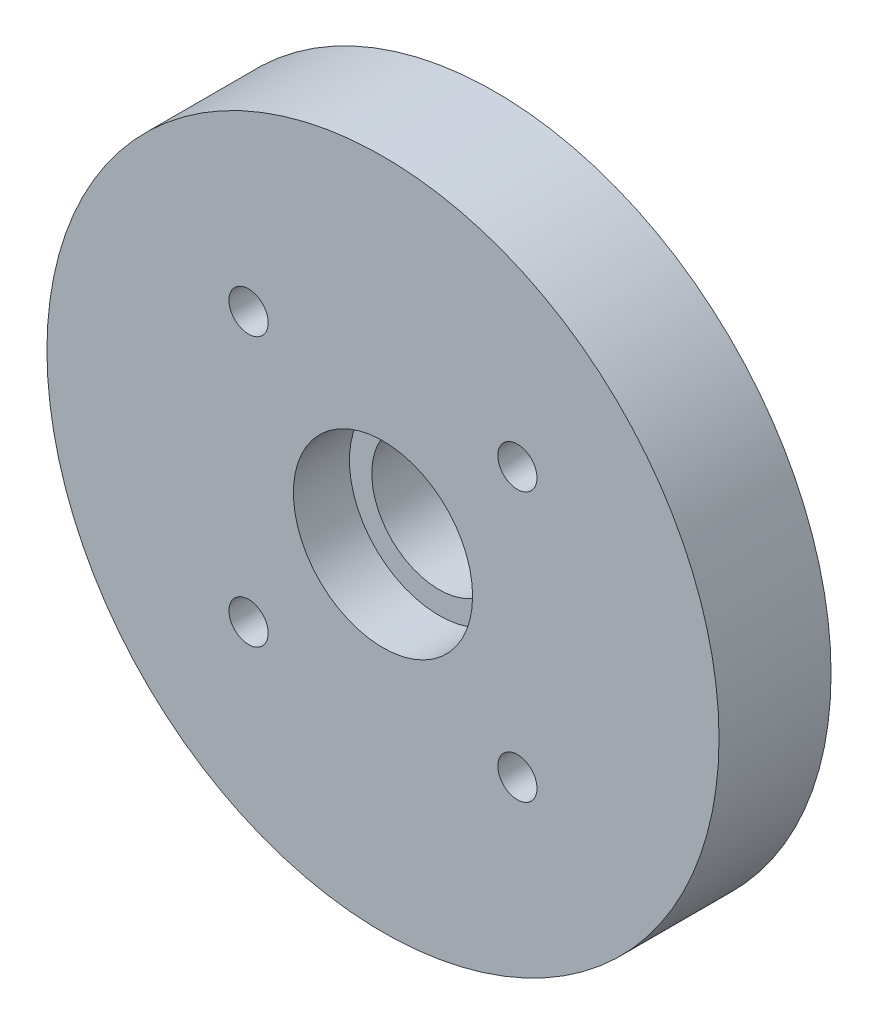
ISO-10303-21;
HEADER;
FILE_DESCRIPTION(('STEP AP214'),'2;1');
FILE_NAME('part.step','',(''),(''),'','','');
FILE_SCHEMA(('AUTOMOTIVE_DESIGN { 1 0 10303 214 1 1 1 1 }'));
ENDSEC;
DATA;
#1=APPLICATION_CONTEXT('core data for automotive mechanical design processes');
#2=APPLICATION_PROTOCOL_DEFINITION('international standard','automotive_design',2000,#1);
#3=PRODUCT_CONTEXT('',#1,'mechanical');
#4=PRODUCT('Part','Part','',(#3));
#5=PRODUCT_RELATED_PRODUCT_CATEGORY('part','',(#4));
#6=PRODUCT_DEFINITION_FORMATION('','',#4);
#7=PRODUCT_DEFINITION_CONTEXT('part definition',#1,'design');
#8=PRODUCT_DEFINITION('design','',#6,#7);
#9=PRODUCT_DEFINITION_SHAPE('','',#8);
#10=(LENGTH_UNIT() NAMED_UNIT(*) SI_UNIT(.MILLI.,.METRE.));
#11=(NAMED_UNIT(*) PLANE_ANGLE_UNIT() SI_UNIT($,.RADIAN.));
#12=(NAMED_UNIT(*) SI_UNIT($,.STERADIAN.) SOLID_ANGLE_UNIT());
#13=UNCERTAINTY_MEASURE_WITH_UNIT(LENGTH_MEASURE(1.E-05),#10,'distance_accuracy_value','');
#14=(GEOMETRIC_REPRESENTATION_CONTEXT(3) GLOBAL_UNCERTAINTY_ASSIGNED_CONTEXT((#13)) GLOBAL_UNIT_ASSIGNED_CONTEXT((#10,
#11,#12)) REPRESENTATION_CONTEXT('',''));
#15=CARTESIAN_POINT('',(0.,0.,0.));
#16=DIRECTION('',(0.,0.,1.));
#17=DIRECTION('',(1.,0.,0.));
#18=AXIS2_PLACEMENT_3D('',#15,#16,#17);
#19=CARTESIAN_POINT('',(0.,0.,10.));
#20=DIRECTION('',(0.,0.,-1.));
#21=DIRECTION('',(-1.,0.,0.));
#22=AXIS2_PLACEMENT_3D('',#19,#20,#21);
#23=CYLINDRICAL_SURFACE('',#22,6.);
#24=CARTESIAN_POINT('',(0.,0.,0.));
#25=DIRECTION('',(0.,0.,1.));
#26=DIRECTION('',(1.,0.,0.));
#27=AXIS2_PLACEMENT_3D('',#24,#25,#26);
#28=CIRCLE('',#27,6.);
#29=CARTESIAN_POINT('',(6.,0.,0.));
#30=VERTEX_POINT('',#29);
#31=EDGE_CURVE('E44',#30,#30,#28,.T.);
#32=ORIENTED_EDGE('',*,*,#31,.F.);
#33=EDGE_LOOP('',(#32));
#34=FACE_BOUND('',#33,.T.);
#35=CARTESIAN_POINT('',(0.,0.,5.));
#36=DIRECTION('',(0.,0.,1.));
#37=DIRECTION('',(1.,0.,0.));
#38=AXIS2_PLACEMENT_3D('',#35,#36,#37);
#39=CIRCLE('',#38,6.);
#40=CARTESIAN_POINT('',(6.,0.,5.));
#41=VERTEX_POINT('',#40);
#42=EDGE_CURVE('E35',#41,#41,#39,.T.);
#43=ORIENTED_EDGE('',*,*,#42,.T.);
#44=EDGE_LOOP('',(#43));
#45=FACE_BOUND('',#44,.T.);
#46=ADVANCED_FACE('F31',(#34,#45),#23,.F.);
#47=CARTESIAN_POINT('',(0.,0.,10.));
#48=DIRECTION('',(0.,0.,1.));
#49=DIRECTION('',(1.,0.,0.));
#50=AXIS2_PLACEMENT_3D('',#47,#48,#49);
#51=PLANE('',#50);
#52=CARTESIAN_POINT('',(-12.,-12.,10.));
#53=DIRECTION('',(0.,0.,1.));
#54=DIRECTION('',(-1.,0.,0.));
#55=AXIS2_PLACEMENT_3D('',#52,#53,#54);
#56=CIRCLE('',#55,1.75);
#57=CARTESIAN_POINT('',(-13.75,-12.,10.));
#58=VERTEX_POINT('',#57);
#59=EDGE_CURVE('E73',#58,#58,#56,.T.);
#60=ORIENTED_EDGE('',*,*,#59,.F.);
#61=EDGE_LOOP('',(#60));
#62=FACE_BOUND('',#61,.T.);
#63=CARTESIAN_POINT('',(12.,-12.,10.));
#64=DIRECTION('',(0.,0.,1.));
#65=DIRECTION('',(1.,0.,0.));
#66=AXIS2_PLACEMENT_3D('',#63,#64,#65);
#67=CIRCLE('',#66,1.75);
#68=CARTESIAN_POINT('',(13.75,-12.,10.));
#69=VERTEX_POINT('',#68);
#70=EDGE_CURVE('E67',#69,#69,#67,.T.);
#71=ORIENTED_EDGE('',*,*,#70,.F.);
#72=EDGE_LOOP('',(#71));
#73=FACE_BOUND('',#72,.T.);
#74=CARTESIAN_POINT('',(12.,12.,10.));
#75=DIRECTION('',(0.,0.,1.));
#76=DIRECTION('',(-1.,0.,0.));
#77=AXIS2_PLACEMENT_3D('',#74,#75,#76);
#78=CIRCLE('',#77,1.75);
#79=CARTESIAN_POINT('',(10.25,12.,10.));
#80=VERTEX_POINT('',#79);
#81=EDGE_CURVE('E61',#80,#80,#78,.T.);
#82=ORIENTED_EDGE('',*,*,#81,.F.);
#83=EDGE_LOOP('',(#82));
#84=FACE_BOUND('',#83,.T.);
#85=CARTESIAN_POINT('',(-12.,12.,10.));
#86=DIRECTION('',(0.,0.,1.));
#87=DIRECTION('',(1.,0.,0.));
#88=AXIS2_PLACEMENT_3D('',#85,#86,#87);
#89=CIRCLE('',#88,1.75);
#90=CARTESIAN_POINT('',(-10.25,12.,10.));
#91=VERTEX_POINT('',#90);
#92=EDGE_CURVE('E55',#91,#91,#89,.T.);
#93=ORIENTED_EDGE('',*,*,#92,.F.);
#94=EDGE_LOOP('',(#93));
#95=FACE_BOUND('',#94,.T.);
#96=CARTESIAN_POINT('',(0.,0.,10.));
#97=DIRECTION('',(0.,0.,1.));
#98=DIRECTION('',(1.,0.,0.));
#99=AXIS2_PLACEMENT_3D('',#96,#97,#98);
#100=CIRCLE('',#99,8.);
#101=CARTESIAN_POINT('',(8.,0.,10.));
#102=VERTEX_POINT('',#101);
#103=EDGE_CURVE('E48',#102,#102,#100,.T.);
#104=ORIENTED_EDGE('',*,*,#103,.F.);
#105=EDGE_LOOP('',(#104));
#106=FACE_BOUND('',#105,.T.);
#107=CARTESIAN_POINT('',(0.,0.,10.));
#108=DIRECTION('',(0.,0.,1.));
#109=DIRECTION('',(1.,0.,0.));
#110=AXIS2_PLACEMENT_3D('',#107,#108,#109);
#111=CIRCLE('',#110,30.);
#112=CARTESIAN_POINT('',(30.,0.,10.));
#113=VERTEX_POINT('',#112);
#114=EDGE_CURVE('E10',#113,#113,#111,.T.);
#115=ORIENTED_EDGE('',*,*,#114,.T.);
#116=EDGE_LOOP('',(#115));
#117=FACE_BOUND('',#116,.T.);
#118=ADVANCED_FACE('F89',(#62,#73,#84,#95,#106,#117),#51,.T.);
#119=CARTESIAN_POINT('',(0.,0.,0.));
#120=DIRECTION('',(0.,0.,1.));
#121=DIRECTION('',(1.,0.,0.));
#122=AXIS2_PLACEMENT_3D('',#119,#120,#121);
#123=PLANE('',#122);
#124=CARTESIAN_POINT('',(-12.,-12.,0.));
#125=DIRECTION('',(0.,0.,1.));
#126=DIRECTION('',(-1.,0.,0.));
#127=AXIS2_PLACEMENT_3D('',#124,#125,#126);
#128=CIRCLE('',#127,1.75);
#129=CARTESIAN_POINT('',(-13.75,-12.,0.));
#130=VERTEX_POINT('',#129);
#131=EDGE_CURVE('E70',#130,#130,#128,.T.);
#132=ORIENTED_EDGE('',*,*,#131,.T.);
#133=EDGE_LOOP('',(#132));
#134=FACE_BOUND('',#133,.T.);
#135=CARTESIAN_POINT('',(12.,-12.,0.));
#136=DIRECTION('',(0.,0.,1.));
#137=DIRECTION('',(1.,0.,0.));
#138=AXIS2_PLACEMENT_3D('',#135,#136,#137);
#139=CIRCLE('',#138,1.75);
#140=CARTESIAN_POINT('',(13.75,-12.,0.));
#141=VERTEX_POINT('',#140);
#142=EDGE_CURVE('E64',#141,#141,#139,.T.);
#143=ORIENTED_EDGE('',*,*,#142,.T.);
#144=EDGE_LOOP('',(#143));
#145=FACE_BOUND('',#144,.T.);
#146=CARTESIAN_POINT('',(12.,12.,0.));
#147=DIRECTION('',(0.,0.,1.));
#148=DIRECTION('',(-1.,0.,0.));
#149=AXIS2_PLACEMENT_3D('',#146,#147,#148);
#150=CIRCLE('',#149,1.75);
#151=CARTESIAN_POINT('',(10.25,12.,0.));
#152=VERTEX_POINT('',#151);
#153=EDGE_CURVE('E58',#152,#152,#150,.T.);
#154=ORIENTED_EDGE('',*,*,#153,.T.);
#155=EDGE_LOOP('',(#154));
#156=FACE_BOUND('',#155,.T.);
#157=CARTESIAN_POINT('',(-12.,12.,0.));
#158=DIRECTION('',(0.,0.,1.));
#159=DIRECTION('',(1.,0.,0.));
#160=AXIS2_PLACEMENT_3D('',#157,#158,#159);
#161=CIRCLE('',#160,1.75);
#162=CARTESIAN_POINT('',(-10.25,12.,0.));
#163=VERTEX_POINT('',#162);
#164=EDGE_CURVE('E52',#163,#163,#161,.T.);
#165=ORIENTED_EDGE('',*,*,#164,.T.);
#166=EDGE_LOOP('',(#165));
#167=FACE_BOUND('',#166,.T.);
#168=CARTESIAN_POINT('',(0.,0.,0.));
#169=DIRECTION('',(0.,0.,1.));
#170=DIRECTION('',(1.,0.,0.));
#171=AXIS2_PLACEMENT_3D('',#168,#169,#170);
#172=CIRCLE('',#171,30.);
#173=CARTESIAN_POINT('',(30.,0.,0.));
#174=VERTEX_POINT('',#173);
#175=EDGE_CURVE('E39',#174,#174,#172,.T.);
#176=ORIENTED_EDGE('',*,*,#175,.F.);
#177=EDGE_LOOP('',(#176));
#178=FACE_BOUND('',#177,.T.);
#179=ORIENTED_EDGE('',*,*,#31,.T.);
#180=EDGE_LOOP('',(#179));
#181=FACE_BOUND('',#180,.T.);
#182=ADVANCED_FACE('F79',(#134,#145,#156,#167,#178,#181),#123,.F.);
#183=CARTESIAN_POINT('',(0.,0.,10.));
#184=DIRECTION('',(0.,0.,-1.));
#185=DIRECTION('',(-1.,0.,0.));
#186=AXIS2_PLACEMENT_3D('',#183,#184,#185);
#187=CYLINDRICAL_SURFACE('',#186,30.);
#188=ORIENTED_EDGE('',*,*,#114,.F.);
#189=EDGE_LOOP('',(#188));
#190=FACE_BOUND('',#189,.T.);
#191=ORIENTED_EDGE('',*,*,#175,.T.);
#192=EDGE_LOOP('',(#191));
#193=FACE_BOUND('',#192,.T.);
#194=ADVANCED_FACE('F33',(#190,#193),#187,.T.);
#195=CARTESIAN_POINT('',(0.,0.,5.));
#196=DIRECTION('',(0.,0.,1.));
#197=DIRECTION('',(1.,0.,0.));
#198=AXIS2_PLACEMENT_3D('',#195,#196,#197);
#199=CYLINDRICAL_SURFACE('',#198,8.);
#200=CARTESIAN_POINT('',(0.,0.,5.));
#201=DIRECTION('',(0.,0.,1.));
#202=DIRECTION('',(1.,0.,0.));
#203=AXIS2_PLACEMENT_3D('',#200,#201,#202);
#204=CIRCLE('',#203,8.);
#205=CARTESIAN_POINT('',(8.,0.,5.));
#206=VERTEX_POINT('',#205);
#207=EDGE_CURVE('E51',#206,#206,#204,.T.);
#208=ORIENTED_EDGE('',*,*,#207,.F.);
#209=EDGE_LOOP('',(#208));
#210=FACE_BOUND('',#209,.T.);
#211=ORIENTED_EDGE('',*,*,#103,.T.);
#212=EDGE_LOOP('',(#211));
#213=FACE_BOUND('',#212,.T.);
#214=ADVANCED_FACE('F101',(#210,#213),#199,.F.);
#215=CARTESIAN_POINT('',(0.,0.,5.));
#216=DIRECTION('',(0.,0.,1.));
#217=DIRECTION('',(1.,0.,0.));
#218=AXIS2_PLACEMENT_3D('',#215,#216,#217);
#219=PLANE('',#218);
#220=ORIENTED_EDGE('',*,*,#42,.F.);
#221=EDGE_LOOP('',(#220));
#222=FACE_BOUND('',#221,.T.);
#223=ORIENTED_EDGE('',*,*,#207,.T.);
#224=EDGE_LOOP('',(#223));
#225=FACE_BOUND('',#224,.T.);
#226=ADVANCED_FACE('F103',(#222,#225),#219,.T.);
#227=CARTESIAN_POINT('',(-12.,12.,0.));
#228=DIRECTION('',(0.,0.,1.));
#229=DIRECTION('',(1.,0.,0.));
#230=AXIS2_PLACEMENT_3D('',#227,#228,#229);
#231=CYLINDRICAL_SURFACE('',#230,1.75);
#232=ORIENTED_EDGE('',*,*,#164,.F.);
#233=EDGE_LOOP('',(#232));
#234=FACE_BOUND('',#233,.T.);
#235=ORIENTED_EDGE('',*,*,#92,.T.);
#236=EDGE_LOOP('',(#235));
#237=FACE_BOUND('',#236,.T.);
#238=ADVANCED_FACE('F110',(#234,#237),#231,.F.);
#239=CARTESIAN_POINT('',(12.,12.,0.));
#240=DIRECTION('',(0.,0.,1.));
#241=DIRECTION('',(1.,0.,0.));
#242=AXIS2_PLACEMENT_3D('',#239,#240,#241);
#243=CYLINDRICAL_SURFACE('',#242,1.75);
#244=ORIENTED_EDGE('',*,*,#153,.F.);
#245=EDGE_LOOP('',(#244));
#246=FACE_BOUND('',#245,.T.);
#247=ORIENTED_EDGE('',*,*,#81,.T.);
#248=EDGE_LOOP('',(#247));
#249=FACE_BOUND('',#248,.T.);
#250=ADVANCED_FACE('F135',(#246,#249),#243,.F.);
#251=CARTESIAN_POINT('',(12.,-12.,0.));
#252=DIRECTION('',(0.,0.,1.));
#253=DIRECTION('',(1.,0.,0.));
#254=AXIS2_PLACEMENT_3D('',#251,#252,#253);
#255=CYLINDRICAL_SURFACE('',#254,1.75);
#256=ORIENTED_EDGE('',*,*,#142,.F.);
#257=EDGE_LOOP('',(#256));
#258=FACE_BOUND('',#257,.T.);
#259=ORIENTED_EDGE('',*,*,#70,.T.);
#260=EDGE_LOOP('',(#259));
#261=FACE_BOUND('',#260,.T.);
#262=ADVANCED_FACE('F85',(#258,#261),#255,.F.);
#263=CARTESIAN_POINT('',(-12.,-12.,0.));
#264=DIRECTION('',(0.,0.,1.));
#265=DIRECTION('',(1.,0.,0.));
#266=AXIS2_PLACEMENT_3D('',#263,#264,#265);
#267=CYLINDRICAL_SURFACE('',#266,1.75);
#268=ORIENTED_EDGE('',*,*,#131,.F.);
#269=EDGE_LOOP('',(#268));
#270=FACE_BOUND('',#269,.T.);
#271=ORIENTED_EDGE('',*,*,#59,.T.);
#272=EDGE_LOOP('',(#271));
#273=FACE_BOUND('',#272,.T.);
#274=ADVANCED_FACE('F82',(#270,#273),#267,.F.);
#275=CLOSED_SHELL('',(#46,#118,#182,#194,#214,#226,#238,#250,#262,#274));
#276=MANIFOLD_SOLID_BREP('B2',#275);
#277=ADVANCED_BREP_SHAPE_REPRESENTATION('',(#18,#276),#14);
#278=SHAPE_DEFINITION_REPRESENTATION(#9,#277);
ENDSEC;
END-ISO-10303-21;
